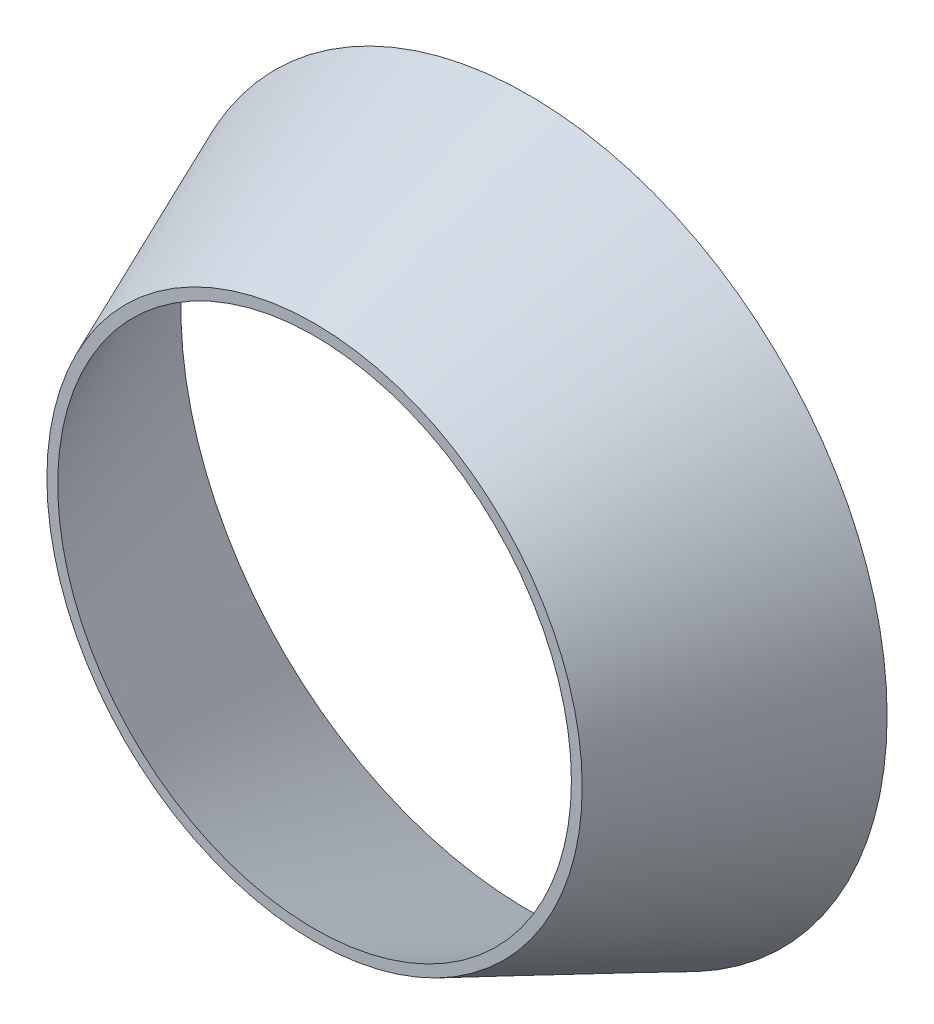
ISO-10303-21;
HEADER;
FILE_DESCRIPTION(('STEP AP214'),'2;1');
FILE_NAME('part.step','',(''),(''),'','','');
FILE_SCHEMA(('AUTOMOTIVE_DESIGN { 1 0 10303 214 1 1 1 1 }'));
ENDSEC;
DATA;
#1=APPLICATION_CONTEXT('core data for automotive mechanical design processes');
#2=APPLICATION_PROTOCOL_DEFINITION('international standard','automotive_design',2000,#1);
#3=PRODUCT_CONTEXT('',#1,'mechanical');
#4=PRODUCT('Part','Part','',(#3));
#5=PRODUCT_RELATED_PRODUCT_CATEGORY('part','',(#4));
#6=PRODUCT_DEFINITION_FORMATION('','',#4);
#7=PRODUCT_DEFINITION_CONTEXT('part definition',#1,'design');
#8=PRODUCT_DEFINITION('design','',#6,#7);
#9=PRODUCT_DEFINITION_SHAPE('','',#8);
#10=(LENGTH_UNIT() NAMED_UNIT(*) SI_UNIT(.MILLI.,.METRE.));
#11=(NAMED_UNIT(*) PLANE_ANGLE_UNIT() SI_UNIT($,.RADIAN.));
#12=(NAMED_UNIT(*) SI_UNIT($,.STERADIAN.) SOLID_ANGLE_UNIT());
#13=UNCERTAINTY_MEASURE_WITH_UNIT(LENGTH_MEASURE(1.E-05),#10,'distance_accuracy_value','');
#14=(GEOMETRIC_REPRESENTATION_CONTEXT(3) GLOBAL_UNCERTAINTY_ASSIGNED_CONTEXT((#13)) GLOBAL_UNIT_ASSIGNED_CONTEXT((#10,
#11,#12)) REPRESENTATION_CONTEXT('',''));
#15=CARTESIAN_POINT('',(0.,0.,0.));
#16=DIRECTION('',(0.,0.,1.));
#17=DIRECTION('',(1.,0.,0.));
#18=AXIS2_PLACEMENT_3D('',#15,#16,#17);
#19=CARTESIAN_POINT('',(0.,0.,0.));
#20=DIRECTION('',(0.,0.,-1.));
#21=DIRECTION('',(1.,0.,0.));
#22=AXIS2_PLACEMENT_3D('',#19,#20,#21);
#23=CONICAL_SURFACE('',#22,5105.4,0.401425727958696);
#24=CARTESIAN_POINT('',(0.,0.,3048.));
#25=DIRECTION('',(0.,0.,1.));
#26=DIRECTION('',(1.,0.,0.));
#27=AXIS2_PLACEMENT_3D('',#24,#25,#26);
#28=CIRCLE('',#27,3811.60076019312);
#29=CARTESIAN_POINT('',(3811.60076019312,0.,3048.));
#30=VERTEX_POINT('',#29);
#31=EDGE_CURVE('E10',#30,#30,#28,.T.);
#32=ORIENTED_EDGE('',*,*,#31,.F.);
#33=EDGE_LOOP('',(#32));
#34=FACE_BOUND('',#33,.T.);
#35=CARTESIAN_POINT('',(0.,0.,0.));
#36=DIRECTION('',(0.,0.,1.));
#37=DIRECTION('',(1.,0.,0.));
#38=AXIS2_PLACEMENT_3D('',#35,#36,#37);
#39=CIRCLE('',#38,5105.4);
#40=CARTESIAN_POINT('',(5105.4,0.,0.));
#41=VERTEX_POINT('',#40);
#42=EDGE_CURVE('E37',#41,#41,#39,.T.);
#43=ORIENTED_EDGE('',*,*,#42,.T.);
#44=EDGE_LOOP('',(#43));
#45=FACE_BOUND('',#44,.T.);
#46=ADVANCED_FACE('F31',(#34,#45),#23,.T.);
#47=CARTESIAN_POINT('',(0.,0.,3048.));
#48=DIRECTION('',(0.,0.,1.));
#49=DIRECTION('',(1.,0.,0.));
#50=AXIS2_PLACEMENT_3D('',#47,#48,#49);
#51=PLANE('',#50);
#52=CARTESIAN_POINT('',(0.,0.,3048.));
#53=DIRECTION('',(0.,0.,1.));
#54=DIRECTION('',(1.,0.,0.));
#55=AXIS2_PLACEMENT_3D('',#52,#53,#54);
#56=CIRCLE('',#55,3657.6);
#57=CARTESIAN_POINT('',(3657.6,0.,3048.));
#58=VERTEX_POINT('',#57);
#59=EDGE_CURVE('E45',#58,#58,#56,.T.);
#60=ORIENTED_EDGE('',*,*,#59,.F.);
#61=EDGE_LOOP('',(#60));
#62=FACE_BOUND('',#61,.T.);
#63=ORIENTED_EDGE('',*,*,#31,.T.);
#64=EDGE_LOOP('',(#63));
#65=FACE_BOUND('',#64,.T.);
#66=ADVANCED_FACE('F53',(#62,#65),#51,.T.);
#67=CARTESIAN_POINT('',(0.,0.,0.));
#68=DIRECTION('',(0.,0.,1.));
#69=DIRECTION('',(1.,0.,0.));
#70=AXIS2_PLACEMENT_3D('',#67,#68,#69);
#71=PLANE('',#70);
#72=CARTESIAN_POINT('',(0.,0.,0.));
#73=DIRECTION('',(0.,0.,1.));
#74=DIRECTION('',(1.,0.,0.));
#75=AXIS2_PLACEMENT_3D('',#72,#73,#74);
#76=CIRCLE('',#75,4951.39923980688);
#77=CARTESIAN_POINT('',(4951.39923980688,0.,0.));
#78=VERTEX_POINT('',#77);
#79=EDGE_CURVE('E41',#78,#78,#76,.T.);
#80=ORIENTED_EDGE('',*,*,#79,.T.);
#81=EDGE_LOOP('',(#80));
#82=FACE_BOUND('',#81,.T.);
#83=ORIENTED_EDGE('',*,*,#42,.F.);
#84=EDGE_LOOP('',(#83));
#85=FACE_BOUND('',#84,.T.);
#86=ADVANCED_FACE('F55',(#82,#85),#71,.F.);
#87=CARTESIAN_POINT('',(0.,0.,3048.));
#88=DIRECTION('',(0.,0.,-1.));
#89=DIRECTION('',(1.,0.,0.));
#90=AXIS2_PLACEMENT_3D('',#87,#88,#89);
#91=CONICAL_SURFACE('',#90,3657.6,0.401425727958696);
#92=ORIENTED_EDGE('',*,*,#79,.F.);
#93=EDGE_LOOP('',(#92));
#94=FACE_BOUND('',#93,.T.);
#95=ORIENTED_EDGE('',*,*,#59,.T.);
#96=EDGE_LOOP('',(#95));
#97=FACE_BOUND('',#96,.T.);
#98=ADVANCED_FACE('F51',(#94,#97),#91,.F.);
#99=CLOSED_SHELL('',(#46,#66,#86,#98));
#100=MANIFOLD_SOLID_BREP('B2',#99);
#101=ADVANCED_BREP_SHAPE_REPRESENTATION('',(#18,#100),#14);
#102=SHAPE_DEFINITION_REPRESENTATION(#9,#101);
ENDSEC;
END-ISO-10303-21;
